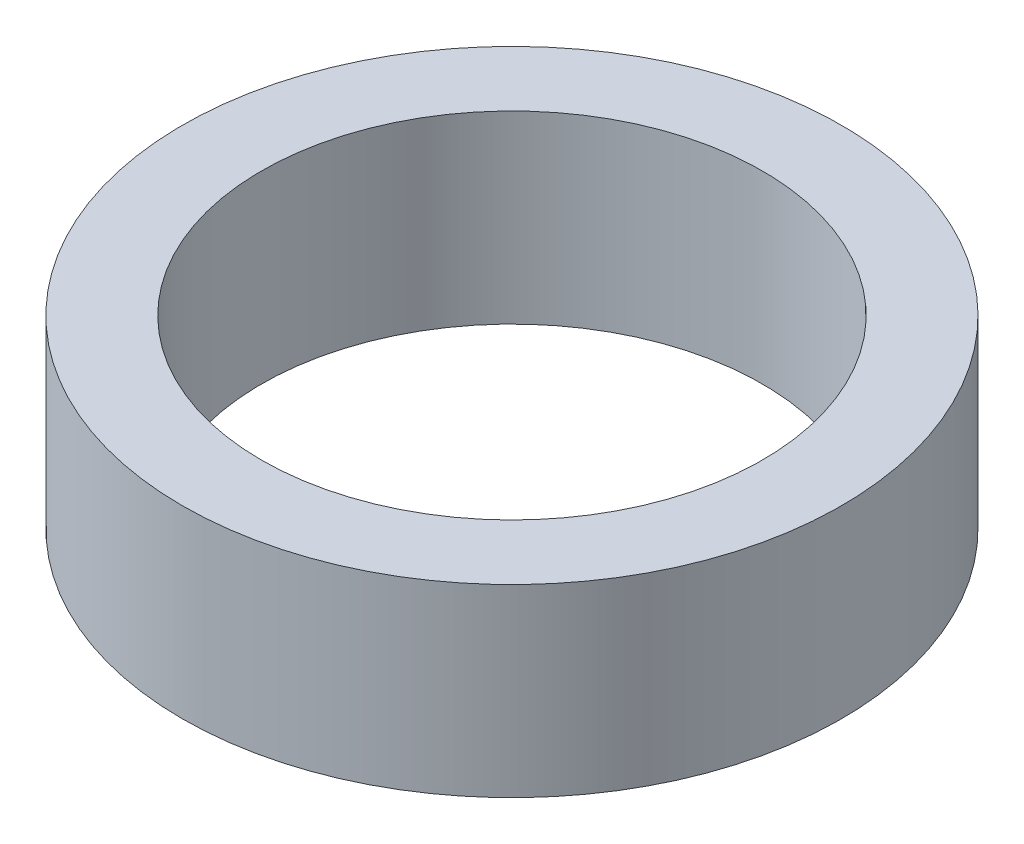
ISO-10303-21;
HEADER;
FILE_DESCRIPTION(('STEP AP214'),'2;1');
FILE_NAME('part.step','',(''),(''),'','','');
FILE_SCHEMA(('AUTOMOTIVE_DESIGN { 1 0 10303 214 1 1 1 1 }'));
ENDSEC;
DATA;
#1=APPLICATION_CONTEXT('core data for automotive mechanical design processes');
#2=APPLICATION_PROTOCOL_DEFINITION('international standard','automotive_design',2000,#1);
#3=PRODUCT_CONTEXT('',#1,'mechanical');
#4=PRODUCT('Part','Part','',(#3));
#5=PRODUCT_RELATED_PRODUCT_CATEGORY('part','',(#4));
#6=PRODUCT_DEFINITION_FORMATION('','',#4);
#7=PRODUCT_DEFINITION_CONTEXT('part definition',#1,'design');
#8=PRODUCT_DEFINITION('design','',#6,#7);
#9=PRODUCT_DEFINITION_SHAPE('','',#8);
#10=(LENGTH_UNIT() NAMED_UNIT(*) SI_UNIT(.MILLI.,.METRE.));
#11=(NAMED_UNIT(*) PLANE_ANGLE_UNIT() SI_UNIT($,.RADIAN.));
#12=(NAMED_UNIT(*) SI_UNIT($,.STERADIAN.) SOLID_ANGLE_UNIT());
#13=UNCERTAINTY_MEASURE_WITH_UNIT(LENGTH_MEASURE(1.E-05),#10,'distance_accuracy_value','');
#14=(GEOMETRIC_REPRESENTATION_CONTEXT(3) GLOBAL_UNCERTAINTY_ASSIGNED_CONTEXT((#13)) GLOBAL_UNIT_ASSIGNED_CONTEXT((#10,
#11,#12)) REPRESENTATION_CONTEXT('',''));
#15=CARTESIAN_POINT('',(0.,0.,0.));
#16=DIRECTION('',(0.,0.,1.));
#17=DIRECTION('',(1.,0.,0.));
#18=AXIS2_PLACEMENT_3D('',#15,#16,#17);
#19=CARTESIAN_POINT('',(0.,3.5,0.));
#20=DIRECTION('',(0.,1.,0.));
#21=DIRECTION('',(0.,0.,1.));
#22=AXIS2_PLACEMENT_3D('',#19,#20,#21);
#23=PLANE('',#22);
#24=CARTESIAN_POINT('',(0.,3.5,0.));
#25=DIRECTION('',(0.,1.,0.));
#26=DIRECTION('',(0.,0.,1.));
#27=AXIS2_PLACEMENT_3D('',#24,#25,#26);
#28=CIRCLE('',#27,6.25);
#29=CARTESIAN_POINT('',(0.,3.5,6.25));
#30=VERTEX_POINT('',#29);
#31=EDGE_CURVE('E10',#30,#30,#28,.T.);
#32=ORIENTED_EDGE('',*,*,#31,.T.);
#33=EDGE_LOOP('',(#32));
#34=FACE_BOUND('',#33,.T.);
#35=CARTESIAN_POINT('',(0.,3.5,0.));
#36=DIRECTION('',(0.,1.,0.));
#37=DIRECTION('',(0.,0.,1.));
#38=AXIS2_PLACEMENT_3D('',#35,#36,#37);
#39=CIRCLE('',#38,4.75);
#40=CARTESIAN_POINT('',(0.,3.5,4.75));
#41=VERTEX_POINT('',#40);
#42=EDGE_CURVE('E50',#41,#41,#39,.T.);
#43=ORIENTED_EDGE('',*,*,#42,.F.);
#44=EDGE_LOOP('',(#43));
#45=FACE_BOUND('',#44,.T.);
#46=ADVANCED_FACE('F39',(#34,#45),#23,.T.);
#47=CARTESIAN_POINT('',(0.,0.,0.));
#48=DIRECTION('',(0.,1.,0.));
#49=DIRECTION('',(0.,0.,1.));
#50=AXIS2_PLACEMENT_3D('',#47,#48,#49);
#51=PLANE('',#50);
#52=CARTESIAN_POINT('',(0.,0.,0.));
#53=DIRECTION('',(0.,1.,0.));
#54=DIRECTION('',(0.,0.,1.));
#55=AXIS2_PLACEMENT_3D('',#52,#53,#54);
#56=CIRCLE('',#55,6.25);
#57=CARTESIAN_POINT('',(0.,0.,6.25));
#58=VERTEX_POINT('',#57);
#59=EDGE_CURVE('E43',#58,#58,#56,.T.);
#60=ORIENTED_EDGE('',*,*,#59,.F.);
#61=EDGE_LOOP('',(#60));
#62=FACE_BOUND('',#61,.T.);
#63=CARTESIAN_POINT('',(0.,0.,0.));
#64=DIRECTION('',(0.,1.,0.));
#65=DIRECTION('',(0.,0.,1.));
#66=AXIS2_PLACEMENT_3D('',#63,#64,#65);
#67=CIRCLE('',#66,4.75);
#68=CARTESIAN_POINT('',(0.,0.,4.75));
#69=VERTEX_POINT('',#68);
#70=EDGE_CURVE('E52',#69,#69,#67,.T.);
#71=ORIENTED_EDGE('',*,*,#70,.T.);
#72=EDGE_LOOP('',(#71));
#73=FACE_BOUND('',#72,.T.);
#74=ADVANCED_FACE('F62',(#62,#73),#51,.F.);
#75=CARTESIAN_POINT('',(0.,3.5,0.));
#76=DIRECTION('',(0.,-1.,0.));
#77=DIRECTION('',(0.,0.,-1.));
#78=AXIS2_PLACEMENT_3D('',#75,#76,#77);
#79=CYLINDRICAL_SURFACE('',#78,6.25);
#80=ORIENTED_EDGE('',*,*,#31,.F.);
#81=EDGE_LOOP('',(#80));
#82=FACE_BOUND('',#81,.T.);
#83=ORIENTED_EDGE('',*,*,#59,.T.);
#84=EDGE_LOOP('',(#83));
#85=FACE_BOUND('',#84,.T.);
#86=ADVANCED_FACE('F41',(#82,#85),#79,.T.);
#87=CARTESIAN_POINT('',(0.,3.5,0.));
#88=DIRECTION('',(0.,-1.,0.));
#89=DIRECTION('',(0.,0.,-1.));
#90=AXIS2_PLACEMENT_3D('',#87,#88,#89);
#91=CYLINDRICAL_SURFACE('',#90,4.75);
#92=ORIENTED_EDGE('',*,*,#42,.T.);
#93=EDGE_LOOP('',(#92));
#94=FACE_BOUND('',#93,.T.);
#95=ORIENTED_EDGE('',*,*,#70,.F.);
#96=EDGE_LOOP('',(#95));
#97=FACE_BOUND('',#96,.T.);
#98=ADVANCED_FACE('F58',(#94,#97),#91,.F.);
#99=CLOSED_SHELL('',(#46,#74,#86,#98));
#100=MANIFOLD_SOLID_BREP('B2',#99);
#101=ADVANCED_BREP_SHAPE_REPRESENTATION('',(#18,#100),#14);
#102=SHAPE_DEFINITION_REPRESENTATION(#9,#101);
ENDSEC;
END-ISO-10303-21;
